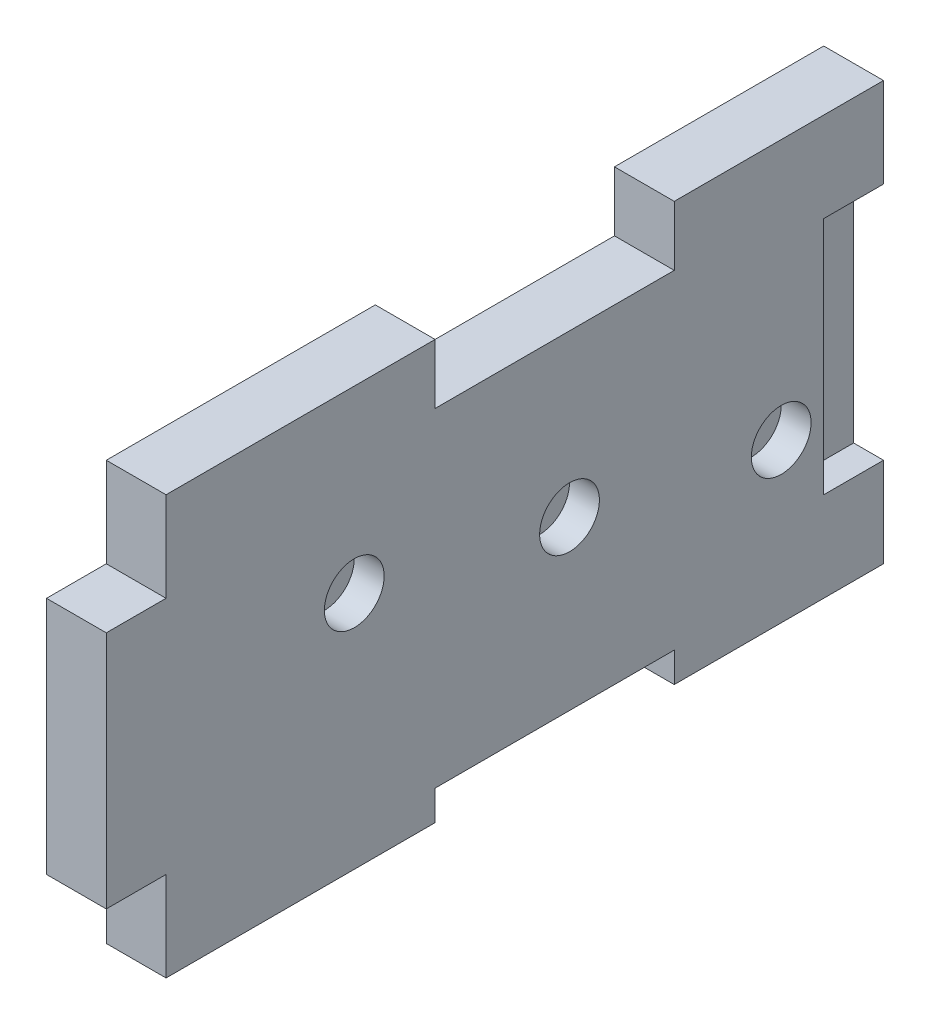
ISO-10303-21;
HEADER;
FILE_DESCRIPTION(('STEP AP214'),'2;1');
FILE_NAME('part.step','',(''),(''),'','','');
FILE_SCHEMA(('AUTOMOTIVE_DESIGN { 1 0 10303 214 1 1 1 1 }'));
ENDSEC;
DATA;
#1=APPLICATION_CONTEXT('core data for automotive mechanical design processes');
#2=APPLICATION_PROTOCOL_DEFINITION('international standard','automotive_design',2000,#1);
#3=PRODUCT_CONTEXT('',#1,'mechanical');
#4=PRODUCT('Part','Part','',(#3));
#5=PRODUCT_RELATED_PRODUCT_CATEGORY('part','',(#4));
#6=PRODUCT_DEFINITION_FORMATION('','',#4);
#7=PRODUCT_DEFINITION_CONTEXT('part definition',#1,'design');
#8=PRODUCT_DEFINITION('design','',#6,#7);
#9=PRODUCT_DEFINITION_SHAPE('','',#8);
#10=(LENGTH_UNIT() NAMED_UNIT(*) SI_UNIT(.MILLI.,.METRE.));
#11=(NAMED_UNIT(*) PLANE_ANGLE_UNIT() SI_UNIT($,.RADIAN.));
#12=(NAMED_UNIT(*) SI_UNIT($,.STERADIAN.) SOLID_ANGLE_UNIT());
#13=UNCERTAINTY_MEASURE_WITH_UNIT(LENGTH_MEASURE(1.E-05),#10,'distance_accuracy_value','');
#14=(GEOMETRIC_REPRESENTATION_CONTEXT(3) GLOBAL_UNCERTAINTY_ASSIGNED_CONTEXT((#13)) GLOBAL_UNIT_ASSIGNED_CONTEXT((#10,
#11,#12)) REPRESENTATION_CONTEXT('',''));
#15=CARTESIAN_POINT('',(0.,0.,0.));
#16=DIRECTION('',(0.,0.,1.));
#17=DIRECTION('',(1.,0.,0.));
#18=AXIS2_PLACEMENT_3D('',#15,#16,#17);
#19=CARTESIAN_POINT('',(5.,0.,35.));
#20=DIRECTION('',(0.,0.,1.));
#21=DIRECTION('',(1.,0.,0.));
#22=AXIS2_PLACEMENT_3D('',#19,#20,#21);
#23=PLANE('',#22);
#24=DIRECTION('',(-1.,0.,0.));
#25=VECTOR('',#24,1.);
#26=CARTESIAN_POINT('',(5.,5.00000000000002,35.));
#27=LINE('',#26,#25);
#28=CARTESIAN_POINT('',(5.,5.00000000000002,35.));
#29=VERTEX_POINT('',#28);
#30=CARTESIAN_POINT('',(-5.,5.00000000000002,35.));
#31=VERTEX_POINT('',#30);
#32=EDGE_CURVE('E304',#29,#31,#27,.T.);
#33=ORIENTED_EDGE('',*,*,#32,.T.);
#34=DIRECTION('',(0.,1.,0.));
#35=VECTOR('',#34,1.);
#36=CARTESIAN_POINT('',(-5.,0.,35.));
#37=LINE('',#36,#35);
#38=CARTESIAN_POINT('',(-5.,0.,35.));
#39=VERTEX_POINT('',#38);
#40=EDGE_CURVE('E204',#39,#31,#37,.T.);
#41=ORIENTED_EDGE('',*,*,#40,.F.);
#42=DIRECTION('',(-1.,0.,0.));
#43=VECTOR('',#42,1.);
#44=CARTESIAN_POINT('',(5.,0.,35.));
#45=LINE('',#44,#43);
#46=CARTESIAN_POINT('',(5.,0.,35.));
#47=VERTEX_POINT('',#46);
#48=EDGE_CURVE('E11',#47,#39,#45,.T.);
#49=ORIENTED_EDGE('',*,*,#48,.F.);
#50=DIRECTION('',(0.,1.,0.));
#51=VECTOR('',#50,1.);
#52=CARTESIAN_POINT('',(5.,0.,35.));
#53=LINE('',#52,#51);
#54=EDGE_CURVE('E262',#47,#29,#53,.T.);
#55=ORIENTED_EDGE('',*,*,#54,.T.);
#56=EDGE_LOOP('',(#33,#41,#49,#55));
#57=FACE_BOUND('',#56,.T.);
#58=ADVANCED_FACE('F37',(#57),#23,.T.);
#59=CARTESIAN_POINT('',(5.,0.,0.));
#60=DIRECTION('',(0.,1.,0.));
#61=DIRECTION('',(0.,0.,1.));
#62=AXIS2_PLACEMENT_3D('',#59,#60,#61);
#63=PLANE('',#62);
#64=ORIENTED_EDGE('',*,*,#48,.T.);
#65=DIRECTION('',(0.,0.,1.));
#66=VECTOR('',#65,1.);
#67=CARTESIAN_POINT('',(-5.,0.,0.));
#68=LINE('',#67,#66);
#69=CARTESIAN_POINT('',(-5.,0.,0.));
#70=VERTEX_POINT('',#69);
#71=EDGE_CURVE('E201',#70,#39,#68,.T.);
#72=ORIENTED_EDGE('',*,*,#71,.F.);
#73=DIRECTION('',(-1.,0.,0.));
#74=VECTOR('',#73,1.);
#75=CARTESIAN_POINT('',(5.,0.,0.));
#76=LINE('',#75,#74);
#77=CARTESIAN_POINT('',(5.,0.,0.));
#78=VERTEX_POINT('',#77);
#79=EDGE_CURVE('E44',#78,#70,#76,.T.);
#80=ORIENTED_EDGE('',*,*,#79,.F.);
#81=DIRECTION('',(0.,0.,-1.));
#82=VECTOR('',#81,1.);
#83=CARTESIAN_POINT('',(5.,0.,0.));
#84=LINE('',#83,#82);
#85=EDGE_CURVE('E271',#47,#78,#84,.T.);
#86=ORIENTED_EDGE('',*,*,#85,.F.);
#87=EDGE_LOOP('',(#64,#72,#80,#86));
#88=FACE_BOUND('',#87,.T.);
#89=ADVANCED_FACE('F340',(#88),#63,.F.);
#90=CARTESIAN_POINT('',(5.,0.,0.));
#91=DIRECTION('',(0.,0.,-1.));
#92=DIRECTION('',(0.,1.,0.));
#93=AXIS2_PLACEMENT_3D('',#90,#91,#92);
#94=PLANE('',#93);
#95=DIRECTION('',(1.,0.,0.));
#96=VECTOR('',#95,1.);
#97=CARTESIAN_POINT('',(0.,15.,0.));
#98=LINE('',#97,#96);
#99=CARTESIAN_POINT('',(0.,15.,0.));
#100=VERTEX_POINT('',#99);
#101=CARTESIAN_POINT('',(5.,15.,0.));
#102=VERTEX_POINT('',#101);
#103=EDGE_CURVE('E205',#100,#102,#98,.T.);
#104=ORIENTED_EDGE('',*,*,#103,.T.);
#105=DIRECTION('',(0.,-1.,0.));
#106=VECTOR('',#105,1.);
#107=CARTESIAN_POINT('',(5.,0.,0.));
#108=LINE('',#107,#106);
#109=EDGE_CURVE('E274',#102,#78,#108,.T.);
#110=ORIENTED_EDGE('',*,*,#109,.T.);
#111=ORIENTED_EDGE('',*,*,#79,.T.);
#112=DIRECTION('',(0.,-1.,0.));
#113=VECTOR('',#112,1.);
#114=CARTESIAN_POINT('',(-5.,70.,0.));
#115=LINE('',#114,#113);
#116=CARTESIAN_POINT('',(-5.,70.,0.));
#117=VERTEX_POINT('',#116);
#118=EDGE_CURVE('E247',#117,#70,#115,.T.);
#119=ORIENTED_EDGE('',*,*,#118,.F.);
#120=DIRECTION('',(-1.,0.,0.));
#121=VECTOR('',#120,1.);
#122=CARTESIAN_POINT('',(5.,70.,0.));
#123=LINE('',#122,#121);
#124=CARTESIAN_POINT('',(5.,70.,0.));
#125=VERTEX_POINT('',#124);
#126=EDGE_CURVE('E330',#125,#117,#123,.T.);
#127=ORIENTED_EDGE('',*,*,#126,.F.);
#128=CARTESIAN_POINT('',(5.,55.,0.));
#129=VERTEX_POINT('',#128);
#130=EDGE_CURVE('E194',#125,#129,#108,.T.);
#131=ORIENTED_EDGE('',*,*,#130,.T.);
#132=DIRECTION('',(1.,0.,0.));
#133=VECTOR('',#132,1.);
#134=CARTESIAN_POINT('',(0.,55.,0.));
#135=LINE('',#134,#133);
#136=CARTESIAN_POINT('',(0.,55.,0.));
#137=VERTEX_POINT('',#136);
#138=EDGE_CURVE('E51',#137,#129,#135,.T.);
#139=ORIENTED_EDGE('',*,*,#138,.F.);
#140=DIRECTION('',(0.,1.,0.));
#141=VECTOR('',#140,1.);
#142=CARTESIAN_POINT('',(0.,55.,0.));
#143=LINE('',#142,#141);
#144=EDGE_CURVE('E180',#100,#137,#143,.T.);
#145=ORIENTED_EDGE('',*,*,#144,.F.);
#146=EDGE_LOOP('',(#104,#110,#111,#119,#127,#131,#139,#145));
#147=FACE_BOUND('',#146,.T.);
#148=ADVANCED_FACE('F192',(#147),#94,.T.);
#149=CARTESIAN_POINT('',(5.,70.,0.));
#150=DIRECTION('',(0.,1.,0.));
#151=DIRECTION('',(0.,0.,1.));
#152=AXIS2_PLACEMENT_3D('',#149,#150,#151);
#153=PLANE('',#152);
#154=ORIENTED_EDGE('',*,*,#126,.T.);
#155=DIRECTION('',(0.,0.,-1.));
#156=VECTOR('',#155,1.);
#157=CARTESIAN_POINT('',(-5.,70.,35.));
#158=LINE('',#157,#156);
#159=CARTESIAN_POINT('',(-5.,70.,35.));
#160=VERTEX_POINT('',#159);
#161=EDGE_CURVE('E244',#160,#117,#158,.T.);
#162=ORIENTED_EDGE('',*,*,#161,.F.);
#163=DIRECTION('',(-1.,0.,0.));
#164=VECTOR('',#163,1.);
#165=CARTESIAN_POINT('',(5.,70.,35.));
#166=LINE('',#165,#164);
#167=CARTESIAN_POINT('',(5.,70.,35.));
#168=VERTEX_POINT('',#167);
#169=EDGE_CURVE('E328',#168,#160,#166,.T.);
#170=ORIENTED_EDGE('',*,*,#169,.F.);
#171=DIRECTION('',(0.,0.,-1.));
#172=VECTOR('',#171,1.);
#173=CARTESIAN_POINT('',(5.,70.,0.));
#174=LINE('',#173,#172);
#175=EDGE_CURVE('E277',#168,#125,#174,.T.);
#176=ORIENTED_EDGE('',*,*,#175,.T.);
#177=EDGE_LOOP('',(#154,#162,#170,#176));
#178=FACE_BOUND('',#177,.T.);
#179=ADVANCED_FACE('F402',(#178),#153,.T.);
#180=CARTESIAN_POINT('',(5.,0.,35.));
#181=DIRECTION('',(0.,0.,-1.));
#182=DIRECTION('',(-1.,0.,0.));
#183=AXIS2_PLACEMENT_3D('',#180,#181,#182);
#184=PLANE('',#183);
#185=ORIENTED_EDGE('',*,*,#169,.T.);
#186=DIRECTION('',(0.,1.,0.));
#187=VECTOR('',#186,1.);
#188=CARTESIAN_POINT('',(-5.,60.,35.));
#189=LINE('',#188,#187);
#190=CARTESIAN_POINT('',(-5.,60.,35.));
#191=VERTEX_POINT('',#190);
#192=EDGE_CURVE('E241',#191,#160,#189,.T.);
#193=ORIENTED_EDGE('',*,*,#192,.F.);
#194=DIRECTION('',(-1.,0.,0.));
#195=VECTOR('',#194,1.);
#196=CARTESIAN_POINT('',(5.,60.,35.));
#197=LINE('',#196,#195);
#198=CARTESIAN_POINT('',(5.,60.,35.));
#199=VERTEX_POINT('',#198);
#200=EDGE_CURVE('E326',#199,#191,#197,.T.);
#201=ORIENTED_EDGE('',*,*,#200,.F.);
#202=DIRECTION('',(0.,-1.,0.));
#203=VECTOR('',#202,1.);
#204=CARTESIAN_POINT('',(5.,0.,35.));
#205=LINE('',#204,#203);
#206=EDGE_CURVE('E280',#168,#199,#205,.T.);
#207=ORIENTED_EDGE('',*,*,#206,.F.);
#208=EDGE_LOOP('',(#185,#193,#201,#207));
#209=FACE_BOUND('',#208,.T.);
#210=ADVANCED_FACE('F400',(#209),#184,.F.);
#211=CARTESIAN_POINT('',(5.,60.,0.));
#212=DIRECTION('',(0.,1.,0.));
#213=DIRECTION('',(0.,0.,1.));
#214=AXIS2_PLACEMENT_3D('',#211,#212,#213);
#215=PLANE('',#214);
#216=ORIENTED_EDGE('',*,*,#200,.T.);
#217=DIRECTION('',(0.,0.,-1.));
#218=VECTOR('',#217,1.);
#219=CARTESIAN_POINT('',(-5.,60.,75.));
#220=LINE('',#219,#218);
#221=CARTESIAN_POINT('',(-5.,60.,75.));
#222=VERTEX_POINT('',#221);
#223=EDGE_CURVE('E238',#222,#191,#220,.T.);
#224=ORIENTED_EDGE('',*,*,#223,.F.);
#225=DIRECTION('',(-1.,0.,0.));
#226=VECTOR('',#225,1.);
#227=CARTESIAN_POINT('',(5.,60.,75.));
#228=LINE('',#227,#226);
#229=CARTESIAN_POINT('',(5.,60.,75.));
#230=VERTEX_POINT('',#229);
#231=EDGE_CURVE('E324',#230,#222,#228,.T.);
#232=ORIENTED_EDGE('',*,*,#231,.F.);
#233=DIRECTION('',(0.,0.,-1.));
#234=VECTOR('',#233,1.);
#235=CARTESIAN_POINT('',(5.,60.,0.));
#236=LINE('',#235,#234);
#237=EDGE_CURVE('E283',#230,#199,#236,.T.);
#238=ORIENTED_EDGE('',*,*,#237,.T.);
#239=EDGE_LOOP('',(#216,#224,#232,#238));
#240=FACE_BOUND('',#239,.T.);
#241=ADVANCED_FACE('F396',(#240),#215,.T.);
#242=CARTESIAN_POINT('',(5.,0.,75.));
#243=DIRECTION('',(0.,0.,-1.));
#244=DIRECTION('',(-1.,0.,0.));
#245=AXIS2_PLACEMENT_3D('',#242,#243,#244);
#246=PLANE('',#245);
#247=ORIENTED_EDGE('',*,*,#231,.T.);
#248=DIRECTION('',(0.,-1.,0.));
#249=VECTOR('',#248,1.);
#250=CARTESIAN_POINT('',(-5.,70.,75.));
#251=LINE('',#250,#249);
#252=CARTESIAN_POINT('',(-5.,70.,75.));
#253=VERTEX_POINT('',#252);
#254=EDGE_CURVE('E235',#253,#222,#251,.T.);
#255=ORIENTED_EDGE('',*,*,#254,.F.);
#256=DIRECTION('',(-1.,0.,0.));
#257=VECTOR('',#256,1.);
#258=CARTESIAN_POINT('',(5.,70.,75.));
#259=LINE('',#258,#257);
#260=CARTESIAN_POINT('',(5.,70.,75.));
#261=VERTEX_POINT('',#260);
#262=EDGE_CURVE('E322',#261,#253,#259,.T.);
#263=ORIENTED_EDGE('',*,*,#262,.F.);
#264=DIRECTION('',(0.,-1.,0.));
#265=VECTOR('',#264,1.);
#266=CARTESIAN_POINT('',(5.,0.,75.));
#267=LINE('',#266,#265);
#268=EDGE_CURVE('E286',#261,#230,#267,.T.);
#269=ORIENTED_EDGE('',*,*,#268,.T.);
#270=EDGE_LOOP('',(#247,#255,#263,#269));
#271=FACE_BOUND('',#270,.T.);
#272=ADVANCED_FACE('F387',(#271),#246,.T.);
#273=ORIENTED_EDGE('',*,*,#262,.T.);
#274=DIRECTION('',(0.,0.,-1.));
#275=VECTOR('',#274,1.);
#276=CARTESIAN_POINT('',(-5.,70.,120.));
#277=LINE('',#276,#275);
#278=CARTESIAN_POINT('',(-5.,70.,120.));
#279=VERTEX_POINT('',#278);
#280=EDGE_CURVE('E232',#279,#253,#277,.T.);
#281=ORIENTED_EDGE('',*,*,#280,.F.);
#282=DIRECTION('',(-1.,0.,0.));
#283=VECTOR('',#282,1.);
#284=CARTESIAN_POINT('',(5.,70.,120.));
#285=LINE('',#284,#283);
#286=CARTESIAN_POINT('',(5.,70.,120.));
#287=VERTEX_POINT('',#286);
#288=EDGE_CURVE('E320',#287,#279,#285,.T.);
#289=ORIENTED_EDGE('',*,*,#288,.F.);
#290=EDGE_CURVE('E281',#287,#261,#174,.T.);
#291=ORIENTED_EDGE('',*,*,#290,.T.);
#292=EDGE_LOOP('',(#273,#281,#289,#291));
#293=FACE_BOUND('',#292,.T.);
#294=ADVANCED_FACE('F383',(#293),#153,.T.);
#295=CARTESIAN_POINT('',(5.,1.11022302462516E-13,120.));
#296=DIRECTION('',(0.,0.,-1.));
#297=DIRECTION('',(0.,1.,0.));
#298=AXIS2_PLACEMENT_3D('',#295,#296,#297);
#299=PLANE('',#298);
#300=ORIENTED_EDGE('',*,*,#288,.T.);
#301=DIRECTION('',(0.,1.,0.));
#302=VECTOR('',#301,1.);
#303=CARTESIAN_POINT('',(-5.,55.,120.));
#304=LINE('',#303,#302);
#305=CARTESIAN_POINT('',(-5.,55.,120.));
#306=VERTEX_POINT('',#305);
#307=EDGE_CURVE('E229',#306,#279,#304,.T.);
#308=ORIENTED_EDGE('',*,*,#307,.F.);
#309=DIRECTION('',(-1.,0.,0.));
#310=VECTOR('',#309,1.);
#311=CARTESIAN_POINT('',(5.,55.,120.));
#312=LINE('',#311,#310);
#313=CARTESIAN_POINT('',(5.,55.,120.));
#314=VERTEX_POINT('',#313);
#315=EDGE_CURVE('E318',#314,#306,#312,.T.);
#316=ORIENTED_EDGE('',*,*,#315,.F.);
#317=DIRECTION('',(0.,-1.,0.));
#318=VECTOR('',#317,1.);
#319=CARTESIAN_POINT('',(5.,1.11022302462516E-13,120.));
#320=LINE('',#319,#318);
#321=EDGE_CURVE('E289',#287,#314,#320,.T.);
#322=ORIENTED_EDGE('',*,*,#321,.F.);
#323=EDGE_LOOP('',(#300,#308,#316,#322));
#324=FACE_BOUND('',#323,.T.);
#325=ADVANCED_FACE('F378',(#324),#299,.F.);
#326=CARTESIAN_POINT('',(5.,54.9999999999999,0.));
#327=DIRECTION('',(0.,1.,0.));
#328=DIRECTION('',(0.,0.,1.));
#329=AXIS2_PLACEMENT_3D('',#326,#327,#328);
#330=PLANE('',#329);
#331=ORIENTED_EDGE('',*,*,#315,.T.);
#332=DIRECTION('',(0.,0.,-1.));
#333=VECTOR('',#332,1.);
#334=CARTESIAN_POINT('',(-5.,55.,130.));
#335=LINE('',#334,#333);
#336=CARTESIAN_POINT('',(-5.,55.,130.));
#337=VERTEX_POINT('',#336);
#338=EDGE_CURVE('E226',#337,#306,#335,.T.);
#339=ORIENTED_EDGE('',*,*,#338,.F.);
#340=DIRECTION('',(-1.,0.,0.));
#341=VECTOR('',#340,1.);
#342=CARTESIAN_POINT('',(5.,55.,130.));
#343=LINE('',#342,#341);
#344=CARTESIAN_POINT('',(5.,55.,130.));
#345=VERTEX_POINT('',#344);
#346=EDGE_CURVE('E316',#345,#337,#343,.T.);
#347=ORIENTED_EDGE('',*,*,#346,.F.);
#348=DIRECTION('',(0.,0.,-1.));
#349=VECTOR('',#348,1.);
#350=CARTESIAN_POINT('',(5.,54.9999999999999,0.));
#351=LINE('',#350,#349);
#352=EDGE_CURVE('E291',#345,#314,#351,.T.);
#353=ORIENTED_EDGE('',*,*,#352,.T.);
#354=EDGE_LOOP('',(#331,#339,#347,#353));
#355=FACE_BOUND('',#354,.T.);
#356=ADVANCED_FACE('F374',(#355),#330,.T.);
#357=CARTESIAN_POINT('',(5.,0.,130.));
#358=DIRECTION('',(0.,0.,-1.));
#359=DIRECTION('',(0.,1.,0.));
#360=AXIS2_PLACEMENT_3D('',#357,#358,#359);
#361=PLANE('',#360);
#362=ORIENTED_EDGE('',*,*,#346,.T.);
#363=DIRECTION('',(0.,1.,0.));
#364=VECTOR('',#363,1.);
#365=CARTESIAN_POINT('',(-5.,15.,130.));
#366=LINE('',#365,#364);
#367=CARTESIAN_POINT('',(-5.,15.,130.));
#368=VERTEX_POINT('',#367);
#369=EDGE_CURVE('E223',#368,#337,#366,.T.);
#370=ORIENTED_EDGE('',*,*,#369,.F.);
#371=DIRECTION('',(-1.,0.,0.));
#372=VECTOR('',#371,1.);
#373=CARTESIAN_POINT('',(5.,15.,130.));
#374=LINE('',#373,#372);
#375=CARTESIAN_POINT('',(5.,15.,130.));
#376=VERTEX_POINT('',#375);
#377=EDGE_CURVE('E314',#376,#368,#374,.T.);
#378=ORIENTED_EDGE('',*,*,#377,.F.);
#379=DIRECTION('',(0.,-1.,0.));
#380=VECTOR('',#379,1.);
#381=CARTESIAN_POINT('',(5.,0.,130.));
#382=LINE('',#381,#380);
#383=EDGE_CURVE('E294',#345,#376,#382,.T.);
#384=ORIENTED_EDGE('',*,*,#383,.F.);
#385=EDGE_LOOP('',(#362,#370,#378,#384));
#386=FACE_BOUND('',#385,.T.);
#387=ADVANCED_FACE('F369',(#386),#361,.F.);
#388=CARTESIAN_POINT('',(5.,15.,0.));
#389=DIRECTION('',(0.,1.,0.));
#390=DIRECTION('',(0.,0.,1.));
#391=AXIS2_PLACEMENT_3D('',#388,#389,#390);
#392=PLANE('',#391);
#393=ORIENTED_EDGE('',*,*,#377,.T.);
#394=DIRECTION('',(0.,0.,1.));
#395=VECTOR('',#394,1.);
#396=CARTESIAN_POINT('',(-5.,15.,120.));
#397=LINE('',#396,#395);
#398=CARTESIAN_POINT('',(-5.,15.,120.));
#399=VERTEX_POINT('',#398);
#400=EDGE_CURVE('E220',#399,#368,#397,.T.);
#401=ORIENTED_EDGE('',*,*,#400,.F.);
#402=DIRECTION('',(-1.,0.,0.));
#403=VECTOR('',#402,1.);
#404=CARTESIAN_POINT('',(5.,15.,120.));
#405=LINE('',#404,#403);
#406=CARTESIAN_POINT('',(5.,15.,120.));
#407=VERTEX_POINT('',#406);
#408=EDGE_CURVE('E312',#407,#399,#405,.T.);
#409=ORIENTED_EDGE('',*,*,#408,.F.);
#410=DIRECTION('',(0.,0.,-1.));
#411=VECTOR('',#410,1.);
#412=CARTESIAN_POINT('',(5.,15.,0.));
#413=LINE('',#412,#411);
#414=EDGE_CURVE('E296',#376,#407,#413,.T.);
#415=ORIENTED_EDGE('',*,*,#414,.F.);
#416=EDGE_LOOP('',(#393,#401,#409,#415));
#417=FACE_BOUND('',#416,.T.);
#418=ADVANCED_FACE('F364',(#417),#392,.F.);
#419=CARTESIAN_POINT('',(5.,0.,120.));
#420=DIRECTION('',(0.,0.,1.));
#421=DIRECTION('',(1.,0.,0.));
#422=AXIS2_PLACEMENT_3D('',#419,#420,#421);
#423=PLANE('',#422);
#424=ORIENTED_EDGE('',*,*,#408,.T.);
#425=DIRECTION('',(0.,1.,0.));
#426=VECTOR('',#425,1.);
#427=CARTESIAN_POINT('',(-5.,0.,120.));
#428=LINE('',#427,#426);
#429=CARTESIAN_POINT('',(-5.,0.,120.));
#430=VERTEX_POINT('',#429);
#431=EDGE_CURVE('E217',#430,#399,#428,.T.);
#432=ORIENTED_EDGE('',*,*,#431,.F.);
#433=DIRECTION('',(-1.,0.,0.));
#434=VECTOR('',#433,1.);
#435=CARTESIAN_POINT('',(5.,0.,120.));
#436=LINE('',#435,#434);
#437=CARTESIAN_POINT('',(5.,0.,120.));
#438=VERTEX_POINT('',#437);
#439=EDGE_CURVE('E310',#438,#430,#436,.T.);
#440=ORIENTED_EDGE('',*,*,#439,.F.);
#441=DIRECTION('',(0.,1.,0.));
#442=VECTOR('',#441,1.);
#443=CARTESIAN_POINT('',(5.,0.,120.));
#444=LINE('',#443,#442);
#445=EDGE_CURVE('E298',#438,#407,#444,.T.);
#446=ORIENTED_EDGE('',*,*,#445,.T.);
#447=EDGE_LOOP('',(#424,#432,#440,#446));
#448=FACE_BOUND('',#447,.T.);
#449=ADVANCED_FACE('F359',(#448),#423,.T.);
#450=ORIENTED_EDGE('',*,*,#439,.T.);
#451=DIRECTION('',(0.,0.,1.));
#452=VECTOR('',#451,1.);
#453=CARTESIAN_POINT('',(-5.,0.,75.));
#454=LINE('',#453,#452);
#455=CARTESIAN_POINT('',(-5.,0.,75.));
#456=VERTEX_POINT('',#455);
#457=EDGE_CURVE('E214',#456,#430,#454,.T.);
#458=ORIENTED_EDGE('',*,*,#457,.F.);
#459=DIRECTION('',(-1.,0.,0.));
#460=VECTOR('',#459,1.);
#461=CARTESIAN_POINT('',(5.,0.,75.));
#462=LINE('',#461,#460);
#463=CARTESIAN_POINT('',(5.,0.,75.));
#464=VERTEX_POINT('',#463);
#465=EDGE_CURVE('E308',#464,#456,#462,.T.);
#466=ORIENTED_EDGE('',*,*,#465,.F.);
#467=EDGE_CURVE('E275',#438,#464,#84,.T.);
#468=ORIENTED_EDGE('',*,*,#467,.F.);
#469=EDGE_LOOP('',(#450,#458,#466,#468));
#470=FACE_BOUND('',#469,.T.);
#471=ADVANCED_FACE('F355',(#470),#63,.F.);
#472=CARTESIAN_POINT('',(5.,0.,75.));
#473=DIRECTION('',(0.,0.,1.));
#474=DIRECTION('',(1.,0.,0.));
#475=AXIS2_PLACEMENT_3D('',#472,#473,#474);
#476=PLANE('',#475);
#477=ORIENTED_EDGE('',*,*,#465,.T.);
#478=DIRECTION('',(0.,-1.,0.));
#479=VECTOR('',#478,1.);
#480=CARTESIAN_POINT('',(-5.,5.00000000000002,75.));
#481=LINE('',#480,#479);
#482=CARTESIAN_POINT('',(-5.,5.00000000000002,75.));
#483=VERTEX_POINT('',#482);
#484=EDGE_CURVE('E211',#483,#456,#481,.T.);
#485=ORIENTED_EDGE('',*,*,#484,.F.);
#486=DIRECTION('',(-1.,0.,0.));
#487=VECTOR('',#486,1.);
#488=CARTESIAN_POINT('',(5.,5.00000000000002,75.));
#489=LINE('',#488,#487);
#490=CARTESIAN_POINT('',(5.,5.00000000000002,75.));
#491=VERTEX_POINT('',#490);
#492=EDGE_CURVE('E306',#491,#483,#489,.T.);
#493=ORIENTED_EDGE('',*,*,#492,.F.);
#494=DIRECTION('',(0.,1.,0.));
#495=VECTOR('',#494,1.);
#496=CARTESIAN_POINT('',(5.,0.,75.));
#497=LINE('',#496,#495);
#498=EDGE_CURVE('E301',#464,#491,#497,.T.);
#499=ORIENTED_EDGE('',*,*,#498,.F.);
#500=EDGE_LOOP('',(#477,#485,#493,#499));
#501=FACE_BOUND('',#500,.T.);
#502=ADVANCED_FACE('F350',(#501),#476,.F.);
#503=CARTESIAN_POINT('',(5.,5.00000000000002,0.));
#504=DIRECTION('',(0.,1.,0.));
#505=DIRECTION('',(0.,0.,1.));
#506=AXIS2_PLACEMENT_3D('',#503,#504,#505);
#507=PLANE('',#506);
#508=ORIENTED_EDGE('',*,*,#492,.T.);
#509=DIRECTION('',(0.,0.,1.));
#510=VECTOR('',#509,1.);
#511=CARTESIAN_POINT('',(-5.,5.00000000000002,35.));
#512=LINE('',#511,#510);
#513=EDGE_CURVE('E208',#31,#483,#512,.T.);
#514=ORIENTED_EDGE('',*,*,#513,.F.);
#515=ORIENTED_EDGE('',*,*,#32,.F.);
#516=DIRECTION('',(0.,0.,-1.));
#517=VECTOR('',#516,1.);
#518=CARTESIAN_POINT('',(5.,5.00000000000002,0.));
#519=LINE('',#518,#517);
#520=EDGE_CURVE('E59',#491,#29,#519,.T.);
#521=ORIENTED_EDGE('',*,*,#520,.F.);
#522=EDGE_LOOP('',(#508,#514,#515,#521));
#523=FACE_BOUND('',#522,.T.);
#524=ADVANCED_FACE('F346',(#523),#507,.F.);
#525=CARTESIAN_POINT('',(5.,0.,0.));
#526=DIRECTION('',(1.,0.,0.));
#527=DIRECTION('',(0.,0.,-1.));
#528=AXIS2_PLACEMENT_3D('',#525,#526,#527);
#529=PLANE('',#528);
#530=DIRECTION('',(0.,0.,-1.));
#531=VECTOR('',#530,1.);
#532=CARTESIAN_POINT('',(5.,15.,0.));
#533=LINE('',#532,#531);
#534=CARTESIAN_POINT('',(5.,15.,9.99999999999999));
#535=VERTEX_POINT('',#534);
#536=EDGE_CURVE('E189',#535,#102,#533,.T.);
#537=ORIENTED_EDGE('',*,*,#536,.F.);
#538=DIRECTION('',(0.,-1.,0.));
#539=VECTOR('',#538,1.);
#540=CARTESIAN_POINT('',(5.,55.,9.99999999999999));
#541=LINE('',#540,#539);
#542=CARTESIAN_POINT('',(5.,55.,9.99999999999999));
#543=VERTEX_POINT('',#542);
#544=EDGE_CURVE('E406',#543,#535,#541,.T.);
#545=ORIENTED_EDGE('',*,*,#544,.F.);
#546=DIRECTION('',(0.,0.,1.));
#547=VECTOR('',#546,1.);
#548=CARTESIAN_POINT('',(5.,55.,0.));
#549=LINE('',#548,#547);
#550=EDGE_CURVE('E404',#129,#543,#549,.T.);
#551=ORIENTED_EDGE('',*,*,#550,.F.);
#552=ORIENTED_EDGE('',*,*,#130,.F.);
#553=ORIENTED_EDGE('',*,*,#175,.F.);
#554=ORIENTED_EDGE('',*,*,#206,.T.);
#555=ORIENTED_EDGE('',*,*,#237,.F.);
#556=ORIENTED_EDGE('',*,*,#268,.F.);
#557=ORIENTED_EDGE('',*,*,#290,.F.);
#558=ORIENTED_EDGE('',*,*,#321,.T.);
#559=ORIENTED_EDGE('',*,*,#352,.F.);
#560=ORIENTED_EDGE('',*,*,#383,.T.);
#561=ORIENTED_EDGE('',*,*,#414,.T.);
#562=ORIENTED_EDGE('',*,*,#445,.F.);
#563=ORIENTED_EDGE('',*,*,#467,.T.);
#564=ORIENTED_EDGE('',*,*,#498,.T.);
#565=ORIENTED_EDGE('',*,*,#520,.T.);
#566=ORIENTED_EDGE('',*,*,#54,.F.);
#567=ORIENTED_EDGE('',*,*,#85,.T.);
#568=ORIENTED_EDGE('',*,*,#109,.F.);
#569=EDGE_LOOP('',(#537,#545,#551,#552,#553,#554,#555,#556,#557,#558,#559,#560,#561,#562,#563,
#564,#565,#566,#567,#568));
#570=FACE_BOUND('',#569,.T.);
#571=CARTESIAN_POINT('',(5.,40.,88.52));
#572=DIRECTION('',(1.,0.,0.));
#573=DIRECTION('',(0.,0.,-1.));
#574=AXIS2_PLACEMENT_3D('',#571,#572,#573);
#575=CIRCLE('',#574,5.00000000000001);
#576=CARTESIAN_POINT('',(5.,40.,83.52));
#577=VERTEX_POINT('',#576);
#578=EDGE_CURVE('E255',#577,#577,#575,.T.);
#579=ORIENTED_EDGE('',*,*,#578,.F.);
#580=EDGE_LOOP('',(#579));
#581=FACE_BOUND('',#580,.T.);
#582=CARTESIAN_POINT('',(5.,26.5,17.1116676472895));
#583=DIRECTION('',(-1.,0.,0.));
#584=DIRECTION('',(0.,0.,1.));
#585=AXIS2_PLACEMENT_3D('',#582,#583,#584);
#586=CIRCLE('',#585,4.99999999999999);
#587=CARTESIAN_POINT('',(5.,26.5,22.1116676472895));
#588=VERTEX_POINT('',#587);
#589=EDGE_CURVE('E259',#588,#588,#586,.T.);
#590=ORIENTED_EDGE('',*,*,#589,.T.);
#591=EDGE_LOOP('',(#590));
#592=FACE_BOUND('',#591,.T.);
#593=CARTESIAN_POINT('',(5.,33.,52.52));
#594=DIRECTION('',(-1.,0.,0.));
#595=DIRECTION('',(0.,0.,1.));
#596=AXIS2_PLACEMENT_3D('',#593,#594,#595);
#597=CIRCLE('',#596,4.99999999999999);
#598=CARTESIAN_POINT('',(5.,33.,57.52));
#599=VERTEX_POINT('',#598);
#600=EDGE_CURVE('E254',#599,#599,#597,.T.);
#601=ORIENTED_EDGE('',*,*,#600,.T.);
#602=EDGE_LOOP('',(#601));
#603=FACE_BOUND('',#602,.T.);
#604=ADVANCED_FACE('F390',(#570,#581,#592,#603),#529,.T.);
#605=CARTESIAN_POINT('',(5.,33.,52.52));
#606=DIRECTION('',(-1.,0.,0.));
#607=DIRECTION('',(0.,0.,1.));
#608=AXIS2_PLACEMENT_3D('',#605,#606,#607);
#609=CYLINDRICAL_SURFACE('',#608,4.99999999999999);
#610=ORIENTED_EDGE('',*,*,#600,.F.);
#611=EDGE_LOOP('',(#610));
#612=FACE_BOUND('',#611,.T.);
#613=CARTESIAN_POINT('',(0.,33.,52.52));
#614=DIRECTION('',(-1.,0.,0.));
#615=DIRECTION('',(0.,0.,1.));
#616=AXIS2_PLACEMENT_3D('',#613,#614,#615);
#617=CIRCLE('',#616,4.99999999999999);
#618=CARTESIAN_POINT('',(0.,33.,57.52));
#619=VERTEX_POINT('',#618);
#620=EDGE_CURVE('E250',#619,#619,#617,.T.);
#621=ORIENTED_EDGE('',*,*,#620,.T.);
#622=EDGE_LOOP('',(#621));
#623=FACE_BOUND('',#622,.T.);
#624=ADVANCED_FACE('F481',(#612,#623),#609,.F.);
#625=CARTESIAN_POINT('',(5.,26.5,17.1116676472895));
#626=DIRECTION('',(-1.,0.,0.));
#627=DIRECTION('',(0.,0.,1.));
#628=AXIS2_PLACEMENT_3D('',#625,#626,#627);
#629=CYLINDRICAL_SURFACE('',#628,4.99999999999999);
#630=ORIENTED_EDGE('',*,*,#589,.F.);
#631=EDGE_LOOP('',(#630));
#632=FACE_BOUND('',#631,.T.);
#633=CARTESIAN_POINT('',(0.,26.5,17.1116676472895));
#634=DIRECTION('',(-1.,0.,0.));
#635=DIRECTION('',(0.,0.,1.));
#636=AXIS2_PLACEMENT_3D('',#633,#634,#635);
#637=CIRCLE('',#636,4.99999999999999);
#638=CARTESIAN_POINT('',(0.,26.5,22.1116676472895));
#639=VERTEX_POINT('',#638);
#640=EDGE_CURVE('E258',#639,#639,#637,.T.);
#641=ORIENTED_EDGE('',*,*,#640,.T.);
#642=EDGE_LOOP('',(#641));
#643=FACE_BOUND('',#642,.T.);
#644=ADVANCED_FACE('F539',(#632,#643),#629,.F.);
#645=CARTESIAN_POINT('',(0.,40.,88.52));
#646=DIRECTION('',(1.,0.,0.));
#647=DIRECTION('',(0.,0.,-1.));
#648=AXIS2_PLACEMENT_3D('',#645,#646,#647);
#649=CYLINDRICAL_SURFACE('',#648,5.00000000000001);
#650=CARTESIAN_POINT('',(0.,40.,88.52));
#651=DIRECTION('',(1.,0.,0.));
#652=DIRECTION('',(0.,0.,-1.));
#653=AXIS2_PLACEMENT_3D('',#650,#651,#652);
#654=CIRCLE('',#653,5.00000000000001);
#655=CARTESIAN_POINT('',(0.,40.,83.52));
#656=VERTEX_POINT('',#655);
#657=EDGE_CURVE('E251',#656,#656,#654,.T.);
#658=ORIENTED_EDGE('',*,*,#657,.F.);
#659=EDGE_LOOP('',(#658));
#660=FACE_BOUND('',#659,.T.);
#661=ORIENTED_EDGE('',*,*,#578,.T.);
#662=EDGE_LOOP('',(#661));
#663=FACE_BOUND('',#662,.T.);
#664=ADVANCED_FACE('F531',(#660,#663),#649,.F.);
#665=CARTESIAN_POINT('',(0.,0.,0.));
#666=DIRECTION('',(-1.,0.,0.));
#667=DIRECTION('',(0.,0.,1.));
#668=AXIS2_PLACEMENT_3D('',#665,#666,#667);
#669=PLANE('',#668);
#670=ORIENTED_EDGE('',*,*,#620,.F.);
#671=EDGE_LOOP('',(#670));
#672=FACE_BOUND('',#671,.T.);
#673=ADVANCED_FACE('F519',(#672),#669,.F.);
#674=ORIENTED_EDGE('',*,*,#640,.F.);
#675=EDGE_LOOP('',(#674));
#676=FACE_BOUND('',#675,.T.);
#677=ADVANCED_FACE('F516',(#676),#669,.F.);
#678=ORIENTED_EDGE('',*,*,#657,.T.);
#679=EDGE_LOOP('',(#678));
#680=FACE_BOUND('',#679,.T.);
#681=ADVANCED_FACE('F512',(#680),#669,.F.);
#682=CARTESIAN_POINT('',(-5.,0.,0.));
#683=DIRECTION('',(-1.,0.,0.));
#684=DIRECTION('',(0.,0.,1.));
#685=AXIS2_PLACEMENT_3D('',#682,#683,#684);
#686=PLANE('',#685);
#687=ORIENTED_EDGE('',*,*,#71,.T.);
#688=ORIENTED_EDGE('',*,*,#40,.T.);
#689=ORIENTED_EDGE('',*,*,#513,.T.);
#690=ORIENTED_EDGE('',*,*,#484,.T.);
#691=ORIENTED_EDGE('',*,*,#457,.T.);
#692=ORIENTED_EDGE('',*,*,#431,.T.);
#693=ORIENTED_EDGE('',*,*,#400,.T.);
#694=ORIENTED_EDGE('',*,*,#369,.T.);
#695=ORIENTED_EDGE('',*,*,#338,.T.);
#696=ORIENTED_EDGE('',*,*,#307,.T.);
#697=ORIENTED_EDGE('',*,*,#280,.T.);
#698=ORIENTED_EDGE('',*,*,#254,.T.);
#699=ORIENTED_EDGE('',*,*,#223,.T.);
#700=ORIENTED_EDGE('',*,*,#192,.T.);
#701=ORIENTED_EDGE('',*,*,#161,.T.);
#702=ORIENTED_EDGE('',*,*,#118,.T.);
#703=EDGE_LOOP('',(#687,#688,#689,#690,#691,#692,#693,#694,#695,#696,#697,#698,#699,#700,#701,#702));
#704=FACE_BOUND('',#703,.T.);
#705=ADVANCED_FACE('F338',(#704),#686,.T.);
#706=CARTESIAN_POINT('',(0.,15.,0.));
#707=DIRECTION('',(0.,-1.,0.));
#708=DIRECTION('',(0.,0.,-1.));
#709=AXIS2_PLACEMENT_3D('',#706,#707,#708);
#710=PLANE('',#709);
#711=ORIENTED_EDGE('',*,*,#536,.T.);
#712=ORIENTED_EDGE('',*,*,#103,.F.);
#713=DIRECTION('',(0.,0.,-1.));
#714=VECTOR('',#713,1.);
#715=CARTESIAN_POINT('',(0.,15.,0.));
#716=LINE('',#715,#714);
#717=CARTESIAN_POINT('',(0.,15.,9.99999999999999));
#718=VERTEX_POINT('',#717);
#719=EDGE_CURVE('E186',#718,#100,#716,.T.);
#720=ORIENTED_EDGE('',*,*,#719,.F.);
#721=DIRECTION('',(1.,0.,0.));
#722=VECTOR('',#721,1.);
#723=CARTESIAN_POINT('',(0.,15.,9.99999999999999));
#724=LINE('',#723,#722);
#725=EDGE_CURVE('E196',#718,#535,#724,.T.);
#726=ORIENTED_EDGE('',*,*,#725,.T.);
#727=EDGE_LOOP('',(#711,#712,#720,#726));
#728=FACE_BOUND('',#727,.T.);
#729=ADVANCED_FACE('F413',(#728),#710,.F.);
#730=CARTESIAN_POINT('',(0.,55.,9.99999999999999));
#731=DIRECTION('',(0.,0.,1.));
#732=DIRECTION('',(1.,0.,0.));
#733=AXIS2_PLACEMENT_3D('',#730,#731,#732);
#734=PLANE('',#733);
#735=ORIENTED_EDGE('',*,*,#544,.T.);
#736=ORIENTED_EDGE('',*,*,#725,.F.);
#737=DIRECTION('',(0.,-1.,0.));
#738=VECTOR('',#737,1.);
#739=CARTESIAN_POINT('',(0.,55.,9.99999999999999));
#740=LINE('',#739,#738);
#741=CARTESIAN_POINT('',(0.,55.,9.99999999999999));
#742=VERTEX_POINT('',#741);
#743=EDGE_CURVE('E179',#742,#718,#740,.T.);
#744=ORIENTED_EDGE('',*,*,#743,.F.);
#745=DIRECTION('',(1.,0.,0.));
#746=VECTOR('',#745,1.);
#747=CARTESIAN_POINT('',(0.,55.,9.99999999999999));
#748=LINE('',#747,#746);
#749=EDGE_CURVE('E175',#742,#543,#748,.T.);
#750=ORIENTED_EDGE('',*,*,#749,.T.);
#751=EDGE_LOOP('',(#735,#736,#744,#750));
#752=FACE_BOUND('',#751,.T.);
#753=ADVANCED_FACE('F415',(#752),#734,.F.);
#754=CARTESIAN_POINT('',(0.,55.,0.));
#755=DIRECTION('',(0.,1.,0.));
#756=DIRECTION('',(0.,0.,1.));
#757=AXIS2_PLACEMENT_3D('',#754,#755,#756);
#758=PLANE('',#757);
#759=ORIENTED_EDGE('',*,*,#550,.T.);
#760=ORIENTED_EDGE('',*,*,#749,.F.);
#761=DIRECTION('',(0.,0.,1.));
#762=VECTOR('',#761,1.);
#763=CARTESIAN_POINT('',(0.,55.,0.));
#764=LINE('',#763,#762);
#765=EDGE_CURVE('E172',#137,#742,#764,.T.);
#766=ORIENTED_EDGE('',*,*,#765,.F.);
#767=ORIENTED_EDGE('',*,*,#138,.T.);
#768=EDGE_LOOP('',(#759,#760,#766,#767));
#769=FACE_BOUND('',#768,.T.);
#770=ADVANCED_FACE('F174',(#769),#758,.F.);
#771=CARTESIAN_POINT('',(0.,0.,0.));
#772=DIRECTION('',(-1.,0.,0.));
#773=DIRECTION('',(0.,0.,1.));
#774=AXIS2_PLACEMENT_3D('',#771,#772,#773);
#775=PLANE('',#774);
#776=ORIENTED_EDGE('',*,*,#144,.T.);
#777=ORIENTED_EDGE('',*,*,#765,.T.);
#778=ORIENTED_EDGE('',*,*,#743,.T.);
#779=ORIENTED_EDGE('',*,*,#719,.T.);
#780=EDGE_LOOP('',(#776,#777,#778,#779));
#781=FACE_BOUND('',#780,.T.);
#782=ADVANCED_FACE('F184',(#781),#775,.F.);
#783=CLOSED_SHELL('',(#58,#89,#148,#179,#210,#241,#272,#294,#325,#356,#387,#418,#449,#471,#502,
#524,#604,#624,#644,#664,#673,#677,#681,#705,#729,#753,#770,#782));
#784=MANIFOLD_SOLID_BREP('B2',#783);
#785=ADVANCED_BREP_SHAPE_REPRESENTATION('',(#18,#784),#14);
#786=SHAPE_DEFINITION_REPRESENTATION(#9,#785);
ENDSEC;
END-ISO-10303-21;
